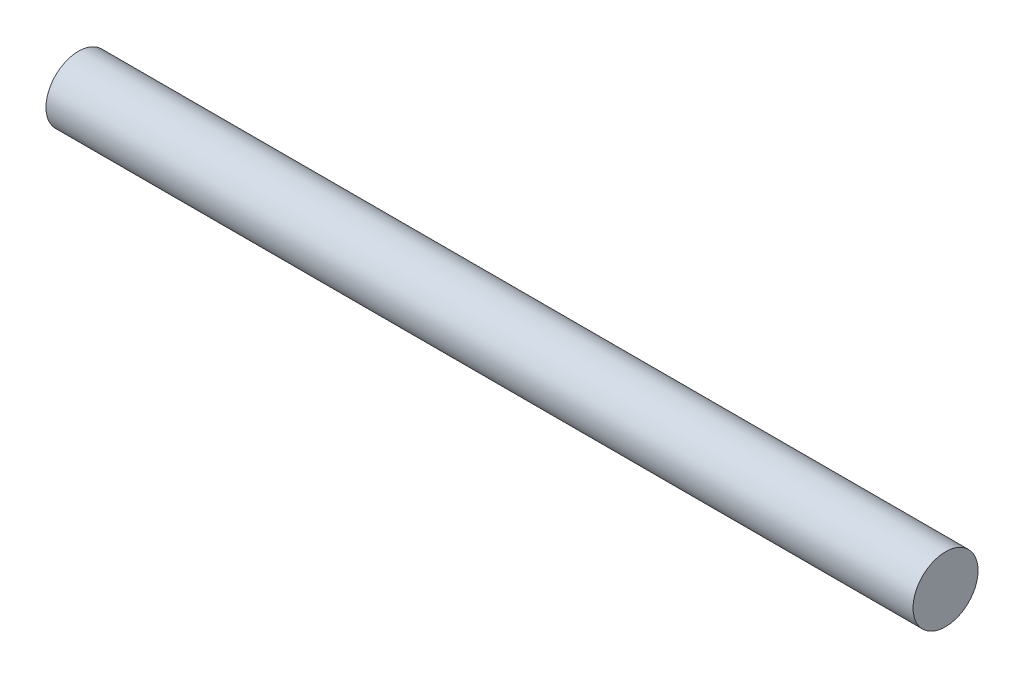
ISO-10303-21;
HEADER;
FILE_DESCRIPTION(('STEP AP214'),'2;1');
FILE_NAME('part.step','',(''),(''),'','','');
FILE_SCHEMA(('AUTOMOTIVE_DESIGN { 1 0 10303 214 1 1 1 1 }'));
ENDSEC;
DATA;
#1=APPLICATION_CONTEXT('core data for automotive mechanical design processes');
#2=APPLICATION_PROTOCOL_DEFINITION('international standard','automotive_design',2000,#1);
#3=PRODUCT_CONTEXT('',#1,'mechanical');
#4=PRODUCT('Part','Part','',(#3));
#5=PRODUCT_RELATED_PRODUCT_CATEGORY('part','',(#4));
#6=PRODUCT_DEFINITION_FORMATION('','',#4);
#7=PRODUCT_DEFINITION_CONTEXT('part definition',#1,'design');
#8=PRODUCT_DEFINITION('design','',#6,#7);
#9=PRODUCT_DEFINITION_SHAPE('','',#8);
#10=(LENGTH_UNIT() NAMED_UNIT(*) SI_UNIT(.MILLI.,.METRE.));
#11=(NAMED_UNIT(*) PLANE_ANGLE_UNIT() SI_UNIT($,.RADIAN.));
#12=(NAMED_UNIT(*) SI_UNIT($,.STERADIAN.) SOLID_ANGLE_UNIT());
#13=UNCERTAINTY_MEASURE_WITH_UNIT(LENGTH_MEASURE(1.E-05),#10,'distance_accuracy_value','');
#14=(GEOMETRIC_REPRESENTATION_CONTEXT(3) GLOBAL_UNCERTAINTY_ASSIGNED_CONTEXT((#13)) GLOBAL_UNIT_ASSIGNED_CONTEXT((#10,
#11,#12)) REPRESENTATION_CONTEXT('',''));
#15=CARTESIAN_POINT('',(0.,0.,0.));
#16=DIRECTION('',(0.,0.,1.));
#17=DIRECTION('',(1.,0.,0.));
#18=AXIS2_PLACEMENT_3D('',#15,#16,#17);
#19=CARTESIAN_POINT('',(-80.,0.,0.));
#20=DIRECTION('',(1.,0.,0.));
#21=DIRECTION('',(0.,0.,-1.));
#22=AXIS2_PLACEMENT_3D('',#19,#20,#21);
#23=PLANE('',#22);
#24=CARTESIAN_POINT('',(-80.,0.,0.));
#25=DIRECTION('',(-1.,0.,0.));
#26=DIRECTION('',(0.,0.,1.));
#27=AXIS2_PLACEMENT_3D('',#24,#25,#26);
#28=CIRCLE('',#27,6.);
#29=CARTESIAN_POINT('',(-80.,0.,6.));
#30=VERTEX_POINT('',#29);
#31=EDGE_CURVE('E10',#30,#30,#28,.T.);
#32=ORIENTED_EDGE('',*,*,#31,.T.);
#33=EDGE_LOOP('',(#32));
#34=FACE_BOUND('',#33,.T.);
#35=ADVANCED_FACE('F32',(#34),#23,.F.);
#36=CARTESIAN_POINT('',(-80.,0.,0.));
#37=DIRECTION('',(-1.,0.,0.));
#38=DIRECTION('',(0.,0.,1.));
#39=AXIS2_PLACEMENT_3D('',#36,#37,#38);
#40=CYLINDRICAL_SURFACE('',#39,6.);
#41=ORIENTED_EDGE('',*,*,#31,.F.);
#42=EDGE_LOOP('',(#41));
#43=FACE_BOUND('',#42,.T.);
#44=CARTESIAN_POINT('',(80.,0.,0.));
#45=DIRECTION('',(-1.,0.,0.));
#46=DIRECTION('',(0.,0.,1.));
#47=AXIS2_PLACEMENT_3D('',#44,#45,#46);
#48=CIRCLE('',#47,6.);
#49=CARTESIAN_POINT('',(80.,0.,6.));
#50=VERTEX_POINT('',#49);
#51=EDGE_CURVE('E38',#50,#50,#48,.T.);
#52=ORIENTED_EDGE('',*,*,#51,.T.);
#53=EDGE_LOOP('',(#52));
#54=FACE_BOUND('',#53,.T.);
#55=ADVANCED_FACE('F44',(#43,#54),#40,.T.);
#56=CARTESIAN_POINT('',(80.,0.,0.));
#57=DIRECTION('',(-1.,0.,0.));
#58=DIRECTION('',(0.,0.,1.));
#59=AXIS2_PLACEMENT_3D('',#56,#57,#58);
#60=PLANE('',#59);
#61=ORIENTED_EDGE('',*,*,#51,.F.);
#62=EDGE_LOOP('',(#61));
#63=FACE_BOUND('',#62,.T.);
#64=ADVANCED_FACE('F46',(#63),#60,.F.);
#65=CLOSED_SHELL('',(#35,#55,#64));
#66=MANIFOLD_SOLID_BREP('B2',#65);
#67=ADVANCED_BREP_SHAPE_REPRESENTATION('',(#18,#66),#14);
#68=SHAPE_DEFINITION_REPRESENTATION(#9,#67);
ENDSEC;
END-ISO-10303-21;
